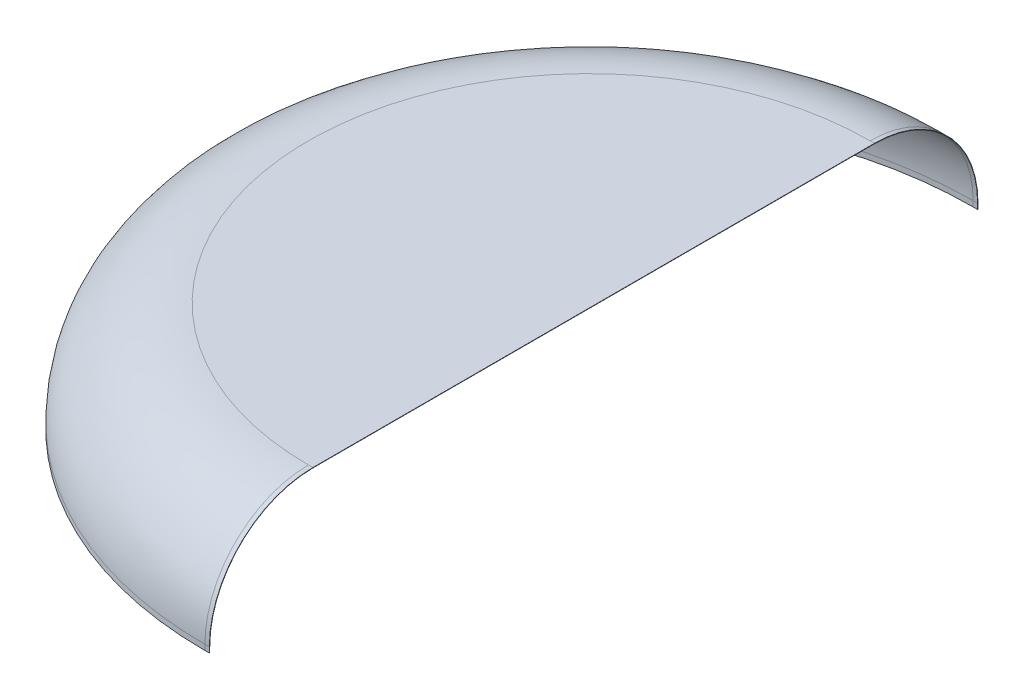
ISO-10303-21;
HEADER;
FILE_DESCRIPTION(('STEP AP214'),'2;1');
FILE_NAME('part.step','',(''),(''),'','','');
FILE_SCHEMA(('AUTOMOTIVE_DESIGN { 1 0 10303 214 1 1 1 1 }'));
ENDSEC;
DATA;
#1=APPLICATION_CONTEXT('core data for automotive mechanical design processes');
#2=APPLICATION_PROTOCOL_DEFINITION('international standard','automotive_design',2000,#1);
#3=PRODUCT_CONTEXT('',#1,'mechanical');
#4=PRODUCT('Part','Part','',(#3));
#5=PRODUCT_RELATED_PRODUCT_CATEGORY('part','',(#4));
#6=PRODUCT_DEFINITION_FORMATION('','',#4);
#7=PRODUCT_DEFINITION_CONTEXT('part definition',#1,'design');
#8=PRODUCT_DEFINITION('design','',#6,#7);
#9=PRODUCT_DEFINITION_SHAPE('','',#8);
#10=(LENGTH_UNIT() NAMED_UNIT(*) SI_UNIT(.MILLI.,.METRE.));
#11=(NAMED_UNIT(*) PLANE_ANGLE_UNIT() SI_UNIT($,.RADIAN.));
#12=(NAMED_UNIT(*) SI_UNIT($,.STERADIAN.) SOLID_ANGLE_UNIT());
#13=UNCERTAINTY_MEASURE_WITH_UNIT(LENGTH_MEASURE(1.E-05),#10,'distance_accuracy_value','');
#14=(GEOMETRIC_REPRESENTATION_CONTEXT(3) GLOBAL_UNCERTAINTY_ASSIGNED_CONTEXT((#13)) GLOBAL_UNIT_ASSIGNED_CONTEXT((#10,
#11,#12)) REPRESENTATION_CONTEXT('',''));
#15=CARTESIAN_POINT('',(0.,0.,0.));
#16=DIRECTION('',(0.,0.,1.));
#17=DIRECTION('',(1.,0.,0.));
#18=AXIS2_PLACEMENT_3D('',#15,#16,#17);
#19=CARTESIAN_POINT('',(12.4,0.,-2135.2));
#20=DIRECTION('',(-1.,0.,0.));
#21=DIRECTION('',(0.,1.,0.));
#22=AXIS2_PLACEMENT_3D('',#19,#20,#21);
#23=PLANE('',#22);
#24=DIRECTION('',(0.,1.,0.));
#25=VECTOR('',#24,1.);
#26=CARTESIAN_POINT('',(12.4,0.,-2135.2));
#27=LINE('',#26,#25);
#28=CARTESIAN_POINT('',(12.4,-15.,-2135.2));
#29=VERTEX_POINT('',#28);
#30=CARTESIAN_POINT('',(12.4,0.,-2135.2));
#31=VERTEX_POINT('',#30);
#32=EDGE_CURVE('E174',#29,#31,#27,.T.);
#33=ORIENTED_EDGE('',*,*,#32,.T.);
#34=CARTESIAN_POINT('',(12.4,0.,-1847.6));
#35=DIRECTION('',(1.,0.,0.));
#36=DIRECTION('',(0.,0.,-1.));
#37=AXIS2_PLACEMENT_3D('',#34,#35,#36);
#38=CIRCLE('',#37,287.6);
#39=CARTESIAN_POINT('',(12.4,287.6,-1847.6));
#40=VERTEX_POINT('',#39);
#41=EDGE_CURVE('E166',#31,#40,#38,.T.);
#42=ORIENTED_EDGE('',*,*,#41,.T.);
#43=DIRECTION('',(0.,0.,1.));
#44=VECTOR('',#43,1.);
#45=CARTESIAN_POINT('',(12.4,287.6,-287.6));
#46=LINE('',#45,#44);
#47=CARTESIAN_POINT('',(12.4,287.6,-287.6));
#48=VERTEX_POINT('',#47);
#49=EDGE_CURVE('E171',#40,#48,#46,.T.);
#50=ORIENTED_EDGE('',*,*,#49,.T.);
#51=CARTESIAN_POINT('',(12.4,0.,-287.6));
#52=DIRECTION('',(1.,0.,0.));
#53=DIRECTION('',(0.,0.,-1.));
#54=AXIS2_PLACEMENT_3D('',#51,#52,#53);
#55=CIRCLE('',#54,287.6);
#56=CARTESIAN_POINT('',(12.4,0.,0.));
#57=VERTEX_POINT('',#56);
#58=EDGE_CURVE('E163',#48,#57,#55,.T.);
#59=ORIENTED_EDGE('',*,*,#58,.T.);
#60=DIRECTION('',(0.,-1.,0.));
#61=VECTOR('',#60,1.);
#62=CARTESIAN_POINT('',(12.4,0.,0.));
#63=LINE('',#62,#61);
#64=CARTESIAN_POINT('',(12.4,-15.,0.));
#65=VERTEX_POINT('',#64);
#66=EDGE_CURVE('E126',#57,#65,#63,.T.);
#67=ORIENTED_EDGE('',*,*,#66,.T.);
#68=DIRECTION('',(0.,0.,1.));
#69=VECTOR('',#68,1.);
#70=CARTESIAN_POINT('',(12.4,-15.,0.));
#71=LINE('',#70,#69);
#72=CARTESIAN_POINT('',(12.4,-15.,-1.));
#73=VERTEX_POINT('',#72);
#74=EDGE_CURVE('E11',#73,#65,#71,.T.);
#75=ORIENTED_EDGE('',*,*,#74,.F.);
#76=DIRECTION('',(0.,-1.,0.));
#77=VECTOR('',#76,1.);
#78=CARTESIAN_POINT('',(12.4,0.,-1.));
#79=LINE('',#78,#77);
#80=CARTESIAN_POINT('',(12.4,0.,-1.));
#81=VERTEX_POINT('',#80);
#82=EDGE_CURVE('E124',#81,#73,#79,.T.);
#83=ORIENTED_EDGE('',*,*,#82,.F.);
#84=CARTESIAN_POINT('',(12.4,0.,-287.6));
#85=DIRECTION('',(1.,0.,0.));
#86=DIRECTION('',(0.,0.,-1.));
#87=AXIS2_PLACEMENT_3D('',#84,#85,#86);
#88=CIRCLE('',#87,286.6);
#89=CARTESIAN_POINT('',(12.4,286.6,-287.6));
#90=VERTEX_POINT('',#89);
#91=EDGE_CURVE('E204',#90,#81,#88,.T.);
#92=ORIENTED_EDGE('',*,*,#91,.F.);
#93=DIRECTION('',(0.,0.,1.));
#94=VECTOR('',#93,1.);
#95=CARTESIAN_POINT('',(12.4,286.6,-287.6));
#96=LINE('',#95,#94);
#97=CARTESIAN_POINT('',(12.4,286.6,-1847.6));
#98=VERTEX_POINT('',#97);
#99=EDGE_CURVE('E207',#98,#90,#96,.T.);
#100=ORIENTED_EDGE('',*,*,#99,.F.);
#101=CARTESIAN_POINT('',(12.4,0.,-1847.6));
#102=DIRECTION('',(1.,0.,0.));
#103=DIRECTION('',(0.,0.,-1.));
#104=AXIS2_PLACEMENT_3D('',#101,#102,#103);
#105=CIRCLE('',#104,286.6);
#106=CARTESIAN_POINT('',(12.4,0.,-2134.2));
#107=VERTEX_POINT('',#106);
#108=EDGE_CURVE('E210',#107,#98,#105,.T.);
#109=ORIENTED_EDGE('',*,*,#108,.F.);
#110=DIRECTION('',(0.,1.,0.));
#111=VECTOR('',#110,1.);
#112=CARTESIAN_POINT('',(12.4,0.,-2134.2));
#113=LINE('',#112,#111);
#114=CARTESIAN_POINT('',(12.4,-15.,-2134.2));
#115=VERTEX_POINT('',#114);
#116=EDGE_CURVE('E217',#115,#107,#113,.T.);
#117=ORIENTED_EDGE('',*,*,#116,.F.);
#118=DIRECTION('',(0.,0.,-1.));
#119=VECTOR('',#118,1.);
#120=CARTESIAN_POINT('',(12.4,-15.,-2135.2));
#121=LINE('',#120,#119);
#122=EDGE_CURVE('E47',#115,#29,#121,.T.);
#123=ORIENTED_EDGE('',*,*,#122,.T.);
#124=EDGE_LOOP('',(#33,#42,#50,#59,#67,#75,#83,#92,#100,#109,#117,#123));
#125=FACE_BOUND('',#124,.T.);
#126=ADVANCED_FACE('F38',(#125),#23,.F.);
#127=CARTESIAN_POINT('',(0.,-15.,0.));
#128=DIRECTION('',(0.,-1.,0.));
#129=DIRECTION('',(1.,0.,0.));
#130=AXIS2_PLACEMENT_3D('',#127,#128,#129);
#131=PLANE('',#130);
#132=DIRECTION('',(1.,0.,0.));
#133=VECTOR('',#132,1.);
#134=CARTESIAN_POINT('',(0.,-15.,-1.));
#135=LINE('',#134,#133);
#136=CARTESIAN_POINT('',(0.,-15.,-1.));
#137=VERTEX_POINT('',#136);
#138=EDGE_CURVE('E132',#137,#73,#135,.T.);
#139=ORIENTED_EDGE('',*,*,#138,.T.);
#140=ORIENTED_EDGE('',*,*,#74,.T.);
#141=DIRECTION('',(1.,0.,0.));
#142=VECTOR('',#141,1.);
#143=CARTESIAN_POINT('',(0.,-15.,0.));
#144=LINE('',#143,#142);
#145=CARTESIAN_POINT('',(0.,-15.,0.));
#146=VERTEX_POINT('',#145);
#147=EDGE_CURVE('E54',#146,#65,#144,.T.);
#148=ORIENTED_EDGE('',*,*,#147,.F.);
#149=CARTESIAN_POINT('',(0.,-15.,-1067.6));
#150=DIRECTION('',(0.,-1.,0.));
#151=DIRECTION('',(0.,0.,-1.));
#152=AXIS2_PLACEMENT_3D('',#149,#150,#151);
#153=CIRCLE('',#152,1067.6);
#154=CARTESIAN_POINT('',(3.72750547734893E-12,-15.,-2135.2));
#155=VERTEX_POINT('',#154);
#156=EDGE_CURVE('E413',#146,#155,#153,.T.);
#157=ORIENTED_EDGE('',*,*,#156,.T.);
#158=DIRECTION('',(1.,0.,0.));
#159=VECTOR('',#158,1.);
#160=CARTESIAN_POINT('',(0.,-15.,-2135.2));
#161=LINE('',#160,#159);
#162=EDGE_CURVE('E176',#155,#29,#161,.T.);
#163=ORIENTED_EDGE('',*,*,#162,.T.);
#164=ORIENTED_EDGE('',*,*,#122,.F.);
#165=DIRECTION('',(-1.,0.,0.));
#166=VECTOR('',#165,1.);
#167=CARTESIAN_POINT('',(0.,-15.,-2134.2));
#168=LINE('',#167,#166);
#169=CARTESIAN_POINT('',(3.72750547734893E-12,-15.,-2134.2));
#170=VERTEX_POINT('',#169);
#171=EDGE_CURVE('E213',#170,#115,#168,.F.);
#172=ORIENTED_EDGE('',*,*,#171,.F.);
#173=CARTESIAN_POINT('',(0.,-15.,-1067.6));
#174=DIRECTION('',(0.,-1.,0.));
#175=DIRECTION('',(0.,0.,-1.));
#176=AXIS2_PLACEMENT_3D('',#173,#174,#175);
#177=CIRCLE('',#176,1066.6);
#178=EDGE_CURVE('E139',#137,#170,#177,.T.);
#179=ORIENTED_EDGE('',*,*,#178,.F.);
#180=EDGE_LOOP('',(#139,#140,#148,#157,#163,#164,#172,#179));
#181=FACE_BOUND('',#180,.T.);
#182=ADVANCED_FACE('F40',(#181),#131,.T.);
#183=CARTESIAN_POINT('',(0.,287.6,-287.6));
#184=DIRECTION('',(0.,1.,0.));
#185=DIRECTION('',(0.,0.,1.));
#186=AXIS2_PLACEMENT_3D('',#183,#184,#185);
#187=PLANE('',#186);
#188=CARTESIAN_POINT('',(0.,287.6,-1067.6));
#189=DIRECTION('',(0.,-1.,0.));
#190=DIRECTION('',(0.,0.,-1.));
#191=AXIS2_PLACEMENT_3D('',#188,#189,#190);
#192=CIRCLE('',#191,780.);
#193=CARTESIAN_POINT('',(0.,287.6,-287.6));
#194=VERTEX_POINT('',#193);
#195=CARTESIAN_POINT('',(2.72335544429764E-12,287.6,-1847.6));
#196=VERTEX_POINT('',#195);
#197=EDGE_CURVE('E145',#194,#196,#192,.T.);
#198=ORIENTED_EDGE('',*,*,#197,.F.);
#199=DIRECTION('',(1.,0.,0.));
#200=VECTOR('',#199,1.);
#201=CARTESIAN_POINT('',(0.,287.6,-287.6));
#202=LINE('',#201,#200);
#203=EDGE_CURVE('E165',#194,#48,#202,.T.);
#204=ORIENTED_EDGE('',*,*,#203,.T.);
#205=ORIENTED_EDGE('',*,*,#49,.F.);
#206=DIRECTION('',(1.,0.,0.));
#207=VECTOR('',#206,1.);
#208=CARTESIAN_POINT('',(0.,287.6,-1847.6));
#209=LINE('',#208,#207);
#210=EDGE_CURVE('E169',#196,#40,#209,.T.);
#211=ORIENTED_EDGE('',*,*,#210,.F.);
#212=EDGE_LOOP('',(#198,#204,#205,#211));
#213=FACE_BOUND('',#212,.T.);
#214=ADVANCED_FACE('F255',(#213),#187,.T.);
#215=CARTESIAN_POINT('',(0.,0.,-1067.6));
#216=DIRECTION('',(0.,-1.,0.));
#217=DIRECTION('',(0.,0.,-1.));
#218=AXIS2_PLACEMENT_3D('',#215,#216,#217);
#219=TOROIDAL_SURFACE('',#218,780.,287.6);
#220=CARTESIAN_POINT('',(5.44671088859529E-12,0.,-1847.6));
#221=DIRECTION('',(1.,0.,0.));
#222=DIRECTION('',(0.,0.,-1.));
#223=AXIS2_PLACEMENT_3D('',#220,#221,#222);
#224=CIRCLE('',#223,287.6);
#225=CARTESIAN_POINT('',(3.72750547734893E-12,0.,-2135.2));
#226=VERTEX_POINT('',#225);
#227=EDGE_CURVE('E155',#226,#196,#224,.T.);
#228=ORIENTED_EDGE('',*,*,#227,.F.);
#229=CARTESIAN_POINT('',(0.,0.,-1067.6));
#230=DIRECTION('',(0.,-1.,0.));
#231=DIRECTION('',(0.,0.,-1.));
#232=AXIS2_PLACEMENT_3D('',#229,#230,#231);
#233=CIRCLE('',#232,1067.6);
#234=CARTESIAN_POINT('',(0.,0.,0.));
#235=VERTEX_POINT('',#234);
#236=EDGE_CURVE('E159',#235,#226,#233,.T.);
#237=ORIENTED_EDGE('',*,*,#236,.F.);
#238=CARTESIAN_POINT('',(0.,0.,-287.6));
#239=DIRECTION('',(-1.,0.,0.));
#240=DIRECTION('',(0.,0.,1.));
#241=AXIS2_PLACEMENT_3D('',#238,#239,#240);
#242=CIRCLE('',#241,287.6);
#243=EDGE_CURVE('E149',#235,#194,#242,.T.);
#244=ORIENTED_EDGE('',*,*,#243,.T.);
#245=ORIENTED_EDGE('',*,*,#197,.T.);
#246=EDGE_LOOP('',(#228,#237,#244,#245));
#247=FACE_BOUND('',#246,.T.);
#248=ADVANCED_FACE('F321',(#247),#219,.T.);
#249=CARTESIAN_POINT('',(0.,287.6,-1067.6));
#250=DIRECTION('',(0.,-1.,0.));
#251=DIRECTION('',(0.,0.,-1.));
#252=AXIS2_PLACEMENT_3D('',#249,#250,#251);
#253=CYLINDRICAL_SURFACE('',#252,1067.6);
#254=DIRECTION('',(0.,1.,0.));
#255=VECTOR('',#254,1.);
#256=CARTESIAN_POINT('',(7.45501095469786E-12,0.,-2135.2));
#257=LINE('',#256,#255);
#258=EDGE_CURVE('E187',#155,#226,#257,.T.);
#259=ORIENTED_EDGE('',*,*,#258,.F.);
#260=ORIENTED_EDGE('',*,*,#156,.F.);
#261=DIRECTION('',(0.,1.,0.));
#262=VECTOR('',#261,1.);
#263=CARTESIAN_POINT('',(0.,0.,0.));
#264=LINE('',#263,#262);
#265=EDGE_CURVE('E410',#146,#235,#264,.T.);
#266=ORIENTED_EDGE('',*,*,#265,.T.);
#267=ORIENTED_EDGE('',*,*,#236,.T.);
#268=EDGE_LOOP('',(#259,#260,#266,#267));
#269=FACE_BOUND('',#268,.T.);
#270=ADVANCED_FACE('F343',(#269),#253,.T.);
#271=CARTESIAN_POINT('',(0.,0.,0.));
#272=DIRECTION('',(0.,0.,1.));
#273=DIRECTION('',(0.,-1.,0.));
#274=AXIS2_PLACEMENT_3D('',#271,#272,#273);
#275=PLANE('',#274);
#276=ORIENTED_EDGE('',*,*,#66,.F.);
#277=DIRECTION('',(1.,0.,0.));
#278=VECTOR('',#277,1.);
#279=CARTESIAN_POINT('',(0.,0.,0.));
#280=LINE('',#279,#278);
#281=EDGE_CURVE('E162',#235,#57,#280,.T.);
#282=ORIENTED_EDGE('',*,*,#281,.F.);
#283=ORIENTED_EDGE('',*,*,#265,.F.);
#284=ORIENTED_EDGE('',*,*,#147,.T.);
#285=EDGE_LOOP('',(#276,#282,#283,#284));
#286=FACE_BOUND('',#285,.T.);
#287=ADVANCED_FACE('F349',(#286),#275,.T.);
#288=CARTESIAN_POINT('',(0.,0.,-287.6));
#289=DIRECTION('',(1.,0.,0.));
#290=DIRECTION('',(0.,0.,-1.));
#291=AXIS2_PLACEMENT_3D('',#288,#289,#290);
#292=CYLINDRICAL_SURFACE('',#291,287.6);
#293=ORIENTED_EDGE('',*,*,#58,.F.);
#294=ORIENTED_EDGE('',*,*,#203,.F.);
#295=ORIENTED_EDGE('',*,*,#243,.F.);
#296=ORIENTED_EDGE('',*,*,#281,.T.);
#297=EDGE_LOOP('',(#293,#294,#295,#296));
#298=FACE_BOUND('',#297,.T.);
#299=ADVANCED_FACE('F360',(#298),#292,.T.);
#300=CARTESIAN_POINT('',(0.,0.,-1847.6));
#301=DIRECTION('',(1.,0.,0.));
#302=DIRECTION('',(0.,0.,-1.));
#303=AXIS2_PLACEMENT_3D('',#300,#301,#302);
#304=CYLINDRICAL_SURFACE('',#303,287.6);
#305=ORIENTED_EDGE('',*,*,#41,.F.);
#306=DIRECTION('',(1.,0.,0.));
#307=VECTOR('',#306,1.);
#308=CARTESIAN_POINT('',(0.,0.,-2135.2));
#309=LINE('',#308,#307);
#310=EDGE_CURVE('E170',#226,#31,#309,.T.);
#311=ORIENTED_EDGE('',*,*,#310,.F.);
#312=ORIENTED_EDGE('',*,*,#227,.T.);
#313=ORIENTED_EDGE('',*,*,#210,.T.);
#314=EDGE_LOOP('',(#305,#311,#312,#313));
#315=FACE_BOUND('',#314,.T.);
#316=ADVANCED_FACE('F370',(#315),#304,.T.);
#317=CARTESIAN_POINT('',(0.,0.,-2135.2));
#318=DIRECTION('',(0.,0.,-1.));
#319=DIRECTION('',(-1.,0.,0.));
#320=AXIS2_PLACEMENT_3D('',#317,#318,#319);
#321=PLANE('',#320);
#322=ORIENTED_EDGE('',*,*,#32,.F.);
#323=ORIENTED_EDGE('',*,*,#162,.F.);
#324=ORIENTED_EDGE('',*,*,#258,.T.);
#325=ORIENTED_EDGE('',*,*,#310,.T.);
#326=EDGE_LOOP('',(#322,#323,#324,#325));
#327=FACE_BOUND('',#326,.T.);
#328=ADVANCED_FACE('F249',(#327),#321,.T.);
#329=CARTESIAN_POINT('',(0.,286.6,-287.6));
#330=DIRECTION('',(0.,1.,0.));
#331=DIRECTION('',(0.,0.,1.));
#332=AXIS2_PLACEMENT_3D('',#329,#330,#331);
#333=PLANE('',#332);
#334=CARTESIAN_POINT('',(0.,286.6,-1067.6));
#335=DIRECTION('',(0.,-1.,0.));
#336=DIRECTION('',(0.,0.,-1.));
#337=AXIS2_PLACEMENT_3D('',#334,#335,#336);
#338=CIRCLE('',#337,780.);
#339=CARTESIAN_POINT('',(0.,286.6,-287.6));
#340=VERTEX_POINT('',#339);
#341=CARTESIAN_POINT('',(2.72335544429764E-12,286.6,-1847.6));
#342=VERTEX_POINT('',#341);
#343=EDGE_CURVE('E177',#340,#342,#338,.T.);
#344=ORIENTED_EDGE('',*,*,#343,.T.);
#345=DIRECTION('',(1.,0.,0.));
#346=VECTOR('',#345,1.);
#347=CARTESIAN_POINT('',(0.,286.6,-1847.6));
#348=LINE('',#347,#346);
#349=EDGE_CURVE('E208',#342,#98,#348,.T.);
#350=ORIENTED_EDGE('',*,*,#349,.T.);
#351=ORIENTED_EDGE('',*,*,#99,.T.);
#352=DIRECTION('',(1.,0.,0.));
#353=VECTOR('',#352,1.);
#354=CARTESIAN_POINT('',(0.,286.6,-287.6));
#355=LINE('',#354,#353);
#356=EDGE_CURVE('E205',#340,#90,#355,.T.);
#357=ORIENTED_EDGE('',*,*,#356,.F.);
#358=EDGE_LOOP('',(#344,#350,#351,#357));
#359=FACE_BOUND('',#358,.T.);
#360=ADVANCED_FACE('F228',(#359),#333,.F.);
#361=CARTESIAN_POINT('',(0.,0.,-1067.6));
#362=DIRECTION('',(0.,-1.,0.));
#363=DIRECTION('',(0.,0.,-1.));
#364=AXIS2_PLACEMENT_3D('',#361,#362,#363);
#365=TOROIDAL_SURFACE('',#364,780.,286.6);
#366=CARTESIAN_POINT('',(3.72750547734893E-12,0.,-1847.6));
#367=DIRECTION('',(1.,0.,0.));
#368=DIRECTION('',(0.,0.,-1.));
#369=AXIS2_PLACEMENT_3D('',#366,#367,#368);
#370=CIRCLE('',#369,286.6);
#371=CARTESIAN_POINT('',(3.72750547734893E-12,0.,-2134.2));
#372=VERTEX_POINT('',#371);
#373=EDGE_CURVE('E193',#372,#342,#370,.T.);
#374=ORIENTED_EDGE('',*,*,#373,.T.);
#375=ORIENTED_EDGE('',*,*,#343,.F.);
#376=CARTESIAN_POINT('',(0.,0.,-287.6));
#377=DIRECTION('',(1.,0.,0.));
#378=DIRECTION('',(0.,0.,-1.));
#379=AXIS2_PLACEMENT_3D('',#376,#377,#378);
#380=CIRCLE('',#379,286.6);
#381=CARTESIAN_POINT('',(0.,0.,-1.));
#382=VERTEX_POINT('',#381);
#383=EDGE_CURVE('E192',#382,#340,#380,.F.);
#384=ORIENTED_EDGE('',*,*,#383,.F.);
#385=CARTESIAN_POINT('',(0.,0.,-1067.6));
#386=DIRECTION('',(0.,-1.,0.));
#387=DIRECTION('',(0.,0.,-1.));
#388=AXIS2_PLACEMENT_3D('',#385,#386,#387);
#389=CIRCLE('',#388,1066.6);
#390=EDGE_CURVE('E196',#382,#372,#389,.T.);
#391=ORIENTED_EDGE('',*,*,#390,.T.);
#392=EDGE_LOOP('',(#374,#375,#384,#391));
#393=FACE_BOUND('',#392,.T.);
#394=ADVANCED_FACE('F241',(#393),#365,.F.);
#395=CARTESIAN_POINT('',(0.,287.6,-1067.6));
#396=DIRECTION('',(0.,-1.,0.));
#397=DIRECTION('',(0.,0.,-1.));
#398=AXIS2_PLACEMENT_3D('',#395,#396,#397);
#399=CYLINDRICAL_SURFACE('',#398,1066.6);
#400=DIRECTION('',(0.,1.,0.));
#401=VECTOR('',#400,1.);
#402=CARTESIAN_POINT('',(3.72750547734893E-12,0.,-2134.2));
#403=LINE('',#402,#401);
#404=EDGE_CURVE('E140',#170,#372,#403,.T.);
#405=ORIENTED_EDGE('',*,*,#404,.T.);
#406=ORIENTED_EDGE('',*,*,#390,.F.);
#407=DIRECTION('',(0.,-1.,0.));
#408=VECTOR('',#407,1.);
#409=CARTESIAN_POINT('',(1.30620827597057E-13,287.6,-0.99999999999989));
#410=LINE('',#409,#408);
#411=EDGE_CURVE('E199',#137,#382,#410,.F.);
#412=ORIENTED_EDGE('',*,*,#411,.F.);
#413=ORIENTED_EDGE('',*,*,#178,.T.);
#414=EDGE_LOOP('',(#405,#406,#412,#413));
#415=FACE_BOUND('',#414,.T.);
#416=ADVANCED_FACE('F237',(#415),#399,.F.);
#417=CARTESIAN_POINT('',(0.,0.,-1.));
#418=DIRECTION('',(0.,0.,1.));
#419=DIRECTION('',(0.,-1.,0.));
#420=AXIS2_PLACEMENT_3D('',#417,#418,#419);
#421=PLANE('',#420);
#422=ORIENTED_EDGE('',*,*,#82,.T.);
#423=ORIENTED_EDGE('',*,*,#138,.F.);
#424=ORIENTED_EDGE('',*,*,#411,.T.);
#425=DIRECTION('',(1.,0.,0.));
#426=VECTOR('',#425,1.);
#427=CARTESIAN_POINT('',(0.,0.,-1.));
#428=LINE('',#427,#426);
#429=EDGE_CURVE('E134',#382,#81,#428,.T.);
#430=ORIENTED_EDGE('',*,*,#429,.T.);
#431=EDGE_LOOP('',(#422,#423,#424,#430));
#432=FACE_BOUND('',#431,.T.);
#433=ADVANCED_FACE('F130',(#432),#421,.F.);
#434=CARTESIAN_POINT('',(0.,0.,-287.6));
#435=DIRECTION('',(1.,0.,0.));
#436=DIRECTION('',(0.,0.,-1.));
#437=AXIS2_PLACEMENT_3D('',#434,#435,#436);
#438=CYLINDRICAL_SURFACE('',#437,286.6);
#439=ORIENTED_EDGE('',*,*,#91,.T.);
#440=ORIENTED_EDGE('',*,*,#429,.F.);
#441=ORIENTED_EDGE('',*,*,#383,.T.);
#442=ORIENTED_EDGE('',*,*,#356,.T.);
#443=EDGE_LOOP('',(#439,#440,#441,#442));
#444=FACE_BOUND('',#443,.T.);
#445=ADVANCED_FACE('F224',(#444),#438,.F.);
#446=CARTESIAN_POINT('',(0.,0.,-1847.6));
#447=DIRECTION('',(1.,0.,0.));
#448=DIRECTION('',(0.,0.,-1.));
#449=AXIS2_PLACEMENT_3D('',#446,#447,#448);
#450=CYLINDRICAL_SURFACE('',#449,286.6);
#451=ORIENTED_EDGE('',*,*,#108,.T.);
#452=ORIENTED_EDGE('',*,*,#349,.F.);
#453=ORIENTED_EDGE('',*,*,#373,.F.);
#454=DIRECTION('',(-1.,0.,0.));
#455=VECTOR('',#454,1.);
#456=CARTESIAN_POINT('',(0.,0.,-2134.2));
#457=LINE('',#456,#455);
#458=EDGE_CURVE('E211',#372,#107,#457,.F.);
#459=ORIENTED_EDGE('',*,*,#458,.T.);
#460=EDGE_LOOP('',(#451,#452,#453,#459));
#461=FACE_BOUND('',#460,.T.);
#462=ADVANCED_FACE('F232',(#461),#450,.F.);
#463=CARTESIAN_POINT('',(0.,0.,-2134.2));
#464=DIRECTION('',(0.,0.,-1.));
#465=DIRECTION('',(-1.,0.,0.));
#466=AXIS2_PLACEMENT_3D('',#463,#464,#465);
#467=PLANE('',#466);
#468=ORIENTED_EDGE('',*,*,#116,.T.);
#469=ORIENTED_EDGE('',*,*,#458,.F.);
#470=ORIENTED_EDGE('',*,*,#404,.F.);
#471=ORIENTED_EDGE('',*,*,#171,.T.);
#472=EDGE_LOOP('',(#468,#469,#470,#471));
#473=FACE_BOUND('',#472,.T.);
#474=ADVANCED_FACE('F234',(#473),#467,.F.);
#475=CLOSED_SHELL('',(#126,#182,#214,#248,#270,#287,#299,#316,#328,#360,#394,#416,#433,#445,
#462,#474));
#476=MANIFOLD_SOLID_BREP('B2',#475);
#477=ADVANCED_BREP_SHAPE_REPRESENTATION('',(#18,#476),#14);
#478=SHAPE_DEFINITION_REPRESENTATION(#9,#477);
ENDSEC;
END-ISO-10303-21;
